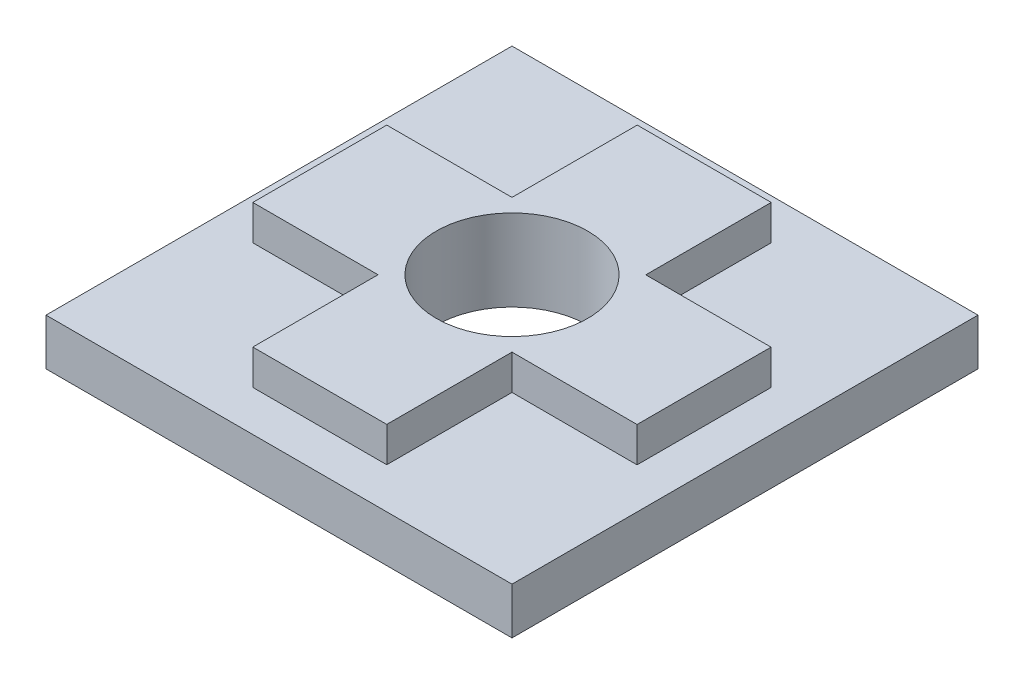
ISO-10303-21;
HEADER;
FILE_DESCRIPTION(('STEP AP214'),'2;1');
FILE_NAME('part.step','',(''),(''),'','','');
FILE_SCHEMA(('AUTOMOTIVE_DESIGN { 1 0 10303 214 1 1 1 1 }'));
ENDSEC;
DATA;
#1=APPLICATION_CONTEXT('core data for automotive mechanical design processes');
#2=APPLICATION_PROTOCOL_DEFINITION('international standard','automotive_design',2000,#1);
#3=PRODUCT_CONTEXT('',#1,'mechanical');
#4=PRODUCT('Part','Part','',(#3));
#5=PRODUCT_RELATED_PRODUCT_CATEGORY('part','',(#4));
#6=PRODUCT_DEFINITION_FORMATION('','',#4);
#7=PRODUCT_DEFINITION_CONTEXT('part definition',#1,'design');
#8=PRODUCT_DEFINITION('design','',#6,#7);
#9=PRODUCT_DEFINITION_SHAPE('','',#8);
#10=(LENGTH_UNIT() NAMED_UNIT(*) SI_UNIT(.MILLI.,.METRE.));
#11=(NAMED_UNIT(*) PLANE_ANGLE_UNIT() SI_UNIT($,.RADIAN.));
#12=(NAMED_UNIT(*) SI_UNIT($,.STERADIAN.) SOLID_ANGLE_UNIT());
#13=UNCERTAINTY_MEASURE_WITH_UNIT(LENGTH_MEASURE(1.E-05),#10,'distance_accuracy_value','');
#14=(GEOMETRIC_REPRESENTATION_CONTEXT(3) GLOBAL_UNCERTAINTY_ASSIGNED_CONTEXT((#13)) GLOBAL_UNIT_ASSIGNED_CONTEXT((#10,
#11,#12)) REPRESENTATION_CONTEXT('',''));
#15=CARTESIAN_POINT('',(0.,0.,0.));
#16=DIRECTION('',(0.,0.,1.));
#17=DIRECTION('',(1.,0.,0.));
#18=AXIS2_PLACEMENT_3D('',#15,#16,#17);
#19=CARTESIAN_POINT('',(0.,3.5,0.));
#20=DIRECTION('',(0.,-1.,0.));
#21=DIRECTION('',(0.,0.,-1.));
#22=AXIS2_PLACEMENT_3D('',#19,#20,#21);
#23=PLANE('',#22);
#24=DIRECTION('',(0.,0.,1.));
#25=VECTOR('',#24,1.);
#26=CARTESIAN_POINT('',(-2.875,3.5,-8.25));
#27=LINE('',#26,#25);
#28=CARTESIAN_POINT('',(-2.875,3.5,-8.25));
#29=VERTEX_POINT('',#28);
#30=CARTESIAN_POINT('',(-2.875,3.5,-2.875));
#31=VERTEX_POINT('',#30);
#32=EDGE_CURVE('E163',#29,#31,#27,.T.);
#33=ORIENTED_EDGE('',*,*,#32,.T.);
#34=DIRECTION('',(-1.,0.,0.));
#35=VECTOR('',#34,1.);
#36=CARTESIAN_POINT('',(-2.875,3.5,-2.875));
#37=LINE('',#36,#35);
#38=CARTESIAN_POINT('',(-8.25,3.5,-2.875));
#39=VERTEX_POINT('',#38);
#40=EDGE_CURVE('E151',#31,#39,#37,.T.);
#41=ORIENTED_EDGE('',*,*,#40,.T.);
#42=DIRECTION('',(0.,0.,1.));
#43=VECTOR('',#42,1.);
#44=CARTESIAN_POINT('',(-8.25,3.5,2.875));
#45=LINE('',#44,#43);
#46=CARTESIAN_POINT('',(-8.25,3.5,2.875));
#47=VERTEX_POINT('',#46);
#48=EDGE_CURVE('E162',#39,#47,#45,.T.);
#49=ORIENTED_EDGE('',*,*,#48,.T.);
#50=DIRECTION('',(1.,0.,0.));
#51=VECTOR('',#50,1.);
#52=CARTESIAN_POINT('',(-8.25,3.5,2.875));
#53=LINE('',#52,#51);
#54=CARTESIAN_POINT('',(-2.875,3.5,2.875));
#55=VERTEX_POINT('',#54);
#56=EDGE_CURVE('E433',#47,#55,#53,.T.);
#57=ORIENTED_EDGE('',*,*,#56,.T.);
#58=DIRECTION('',(0.,0.,1.));
#59=VECTOR('',#58,1.);
#60=CARTESIAN_POINT('',(-2.875,3.5,2.875));
#61=LINE('',#60,#59);
#62=CARTESIAN_POINT('',(-2.875,3.5,8.25));
#63=VERTEX_POINT('',#62);
#64=EDGE_CURVE('E436',#55,#63,#61,.T.);
#65=ORIENTED_EDGE('',*,*,#64,.T.);
#66=DIRECTION('',(1.,0.,0.));
#67=VECTOR('',#66,1.);
#68=CARTESIAN_POINT('',(-2.875,3.5,8.25));
#69=LINE('',#68,#67);
#70=CARTESIAN_POINT('',(2.875,3.5,8.25));
#71=VERTEX_POINT('',#70);
#72=EDGE_CURVE('E439',#63,#71,#69,.T.);
#73=ORIENTED_EDGE('',*,*,#72,.T.);
#74=DIRECTION('',(0.,0.,-1.));
#75=VECTOR('',#74,1.);
#76=CARTESIAN_POINT('',(2.875,3.5,8.25));
#77=LINE('',#76,#75);
#78=CARTESIAN_POINT('',(2.875,3.5,2.875));
#79=VERTEX_POINT('',#78);
#80=EDGE_CURVE('E442',#71,#79,#77,.T.);
#81=ORIENTED_EDGE('',*,*,#80,.T.);
#82=DIRECTION('',(0.999999019991865,0.,0.00140000546784625));
#83=VECTOR('',#82,1.);
#84=CARTESIAN_POINT('',(2.875,3.5,2.875));
#85=LINE('',#84,#83);
#86=CARTESIAN_POINT('',(8.25,3.5,2.88252503676427));
#87=VERTEX_POINT('',#86);
#88=EDGE_CURVE('E445',#79,#87,#85,.T.);
#89=ORIENTED_EDGE('',*,*,#88,.T.);
#90=DIRECTION('',(0.,0.,-1.));
#91=VECTOR('',#90,1.);
#92=CARTESIAN_POINT('',(8.25,3.5,2.88252503676427));
#93=LINE('',#92,#91);
#94=CARTESIAN_POINT('',(8.25,3.5,-2.86747496323573));
#95=VERTEX_POINT('',#94);
#96=EDGE_CURVE('E448',#87,#95,#93,.T.);
#97=ORIENTED_EDGE('',*,*,#96,.T.);
#98=DIRECTION('',(-1.,0.,0.));
#99=VECTOR('',#98,1.);
#100=CARTESIAN_POINT('',(8.25,3.5,-2.86747496323573));
#101=LINE('',#100,#99);
#102=CARTESIAN_POINT('',(2.875,3.5,-2.86747496323573));
#103=VERTEX_POINT('',#102);
#104=EDGE_CURVE('E451',#95,#103,#101,.T.);
#105=ORIENTED_EDGE('',*,*,#104,.T.);
#106=DIRECTION('',(0.,0.,-1.));
#107=VECTOR('',#106,1.);
#108=CARTESIAN_POINT('',(2.875,3.5,-2.86747496323573));
#109=LINE('',#108,#107);
#110=CARTESIAN_POINT('',(2.875,3.5,-8.25));
#111=VERTEX_POINT('',#110);
#112=EDGE_CURVE('E454',#103,#111,#109,.T.);
#113=ORIENTED_EDGE('',*,*,#112,.T.);
#114=DIRECTION('',(-1.,0.,0.));
#115=VECTOR('',#114,1.);
#116=CARTESIAN_POINT('',(-2.875,3.5,-8.25));
#117=LINE('',#116,#115);
#118=EDGE_CURVE('E168',#111,#29,#117,.T.);
#119=ORIENTED_EDGE('',*,*,#118,.T.);
#120=EDGE_LOOP('',(#33,#41,#49,#57,#65,#73,#81,#89,#97,#105,#113,#119));
#121=FACE_BOUND('',#120,.T.);
#122=CARTESIAN_POINT('',(0.,3.5,0.));
#123=DIRECTION('',(0.,1.,0.));
#124=DIRECTION('',(0.,0.,1.));
#125=AXIS2_PLACEMENT_3D('',#122,#123,#124);
#126=CIRCLE('',#125,3.25);
#127=CARTESIAN_POINT('',(0.,3.5,3.25));
#128=VERTEX_POINT('',#127);
#129=EDGE_CURVE('E425',#128,#128,#126,.T.);
#130=ORIENTED_EDGE('',*,*,#129,.F.);
#131=EDGE_LOOP('',(#130));
#132=FACE_BOUND('',#131,.T.);
#133=ADVANCED_FACE('F39',(#121,#132),#23,.F.);
#134=CARTESIAN_POINT('',(10.,2.,-10.));
#135=DIRECTION('',(-1.,0.,0.));
#136=DIRECTION('',(0.,0.,1.));
#137=AXIS2_PLACEMENT_3D('',#134,#135,#136);
#138=PLANE('',#137);
#139=DIRECTION('',(0.,0.,-1.));
#140=VECTOR('',#139,1.);
#141=CARTESIAN_POINT('',(10.,0.,-10.));
#142=LINE('',#141,#140);
#143=CARTESIAN_POINT('',(10.,0.,10.));
#144=VERTEX_POINT('',#143);
#145=CARTESIAN_POINT('',(10.,0.,-10.));
#146=VERTEX_POINT('',#145);
#147=EDGE_CURVE('E176',#144,#146,#142,.T.);
#148=ORIENTED_EDGE('',*,*,#147,.T.);
#149=DIRECTION('',(0.,-1.,0.));
#150=VECTOR('',#149,1.);
#151=CARTESIAN_POINT('',(10.,2.,-10.));
#152=LINE('',#151,#150);
#153=CARTESIAN_POINT('',(10.,2.,-10.));
#154=VERTEX_POINT('',#153);
#155=EDGE_CURVE('E11',#154,#146,#152,.T.);
#156=ORIENTED_EDGE('',*,*,#155,.F.);
#157=DIRECTION('',(0.,0.,-1.));
#158=VECTOR('',#157,1.);
#159=CARTESIAN_POINT('',(10.,2.,-10.));
#160=LINE('',#159,#158);
#161=CARTESIAN_POINT('',(10.,2.,10.));
#162=VERTEX_POINT('',#161);
#163=EDGE_CURVE('E187',#162,#154,#160,.T.);
#164=ORIENTED_EDGE('',*,*,#163,.F.);
#165=DIRECTION('',(0.,-1.,0.));
#166=VECTOR('',#165,1.);
#167=CARTESIAN_POINT('',(10.,2.,10.));
#168=LINE('',#167,#166);
#169=EDGE_CURVE('E200',#162,#144,#168,.T.);
#170=ORIENTED_EDGE('',*,*,#169,.T.);
#171=EDGE_LOOP('',(#148,#156,#164,#170));
#172=FACE_BOUND('',#171,.T.);
#173=ADVANCED_FACE('F41',(#172),#138,.F.);
#174=CARTESIAN_POINT('',(-10.,2.,-10.));
#175=DIRECTION('',(0.,0.,1.));
#176=DIRECTION('',(1.,0.,0.));
#177=AXIS2_PLACEMENT_3D('',#174,#175,#176);
#178=PLANE('',#177);
#179=DIRECTION('',(-1.,0.,0.));
#180=VECTOR('',#179,1.);
#181=CARTESIAN_POINT('',(-10.,0.,-10.));
#182=LINE('',#181,#180);
#183=CARTESIAN_POINT('',(-10.,0.,-10.));
#184=VERTEX_POINT('',#183);
#185=EDGE_CURVE('E181',#146,#184,#182,.T.);
#186=ORIENTED_EDGE('',*,*,#185,.T.);
#187=DIRECTION('',(0.,-1.,0.));
#188=VECTOR('',#187,1.);
#189=CARTESIAN_POINT('',(-10.,2.,-10.));
#190=LINE('',#189,#188);
#191=CARTESIAN_POINT('',(-10.,2.,-10.));
#192=VERTEX_POINT('',#191);
#193=EDGE_CURVE('E48',#192,#184,#190,.T.);
#194=ORIENTED_EDGE('',*,*,#193,.F.);
#195=DIRECTION('',(-1.,0.,0.));
#196=VECTOR('',#195,1.);
#197=CARTESIAN_POINT('',(-10.,2.,-10.));
#198=LINE('',#197,#196);
#199=EDGE_CURVE('E191',#154,#192,#198,.T.);
#200=ORIENTED_EDGE('',*,*,#199,.F.);
#201=ORIENTED_EDGE('',*,*,#155,.T.);
#202=EDGE_LOOP('',(#186,#194,#200,#201));
#203=FACE_BOUND('',#202,.T.);
#204=ADVANCED_FACE('F237',(#203),#178,.F.);
#205=CARTESIAN_POINT('',(-10.,2.,-10.));
#206=DIRECTION('',(1.,0.,0.));
#207=DIRECTION('',(0.,0.,-1.));
#208=AXIS2_PLACEMENT_3D('',#205,#206,#207);
#209=PLANE('',#208);
#210=DIRECTION('',(0.,0.,1.));
#211=VECTOR('',#210,1.);
#212=CARTESIAN_POINT('',(-10.,0.,-10.));
#213=LINE('',#212,#211);
#214=CARTESIAN_POINT('',(-10.,0.,10.));
#215=VERTEX_POINT('',#214);
#216=EDGE_CURVE('E204',#184,#215,#213,.T.);
#217=ORIENTED_EDGE('',*,*,#216,.T.);
#218=DIRECTION('',(0.,-1.,0.));
#219=VECTOR('',#218,1.);
#220=CARTESIAN_POINT('',(-10.,2.,10.));
#221=LINE('',#220,#219);
#222=CARTESIAN_POINT('',(-10.,2.,10.));
#223=VERTEX_POINT('',#222);
#224=EDGE_CURVE('E212',#223,#215,#221,.T.);
#225=ORIENTED_EDGE('',*,*,#224,.F.);
#226=DIRECTION('',(0.,0.,1.));
#227=VECTOR('',#226,1.);
#228=CARTESIAN_POINT('',(-10.,2.,-10.));
#229=LINE('',#228,#227);
#230=EDGE_CURVE('E195',#192,#223,#229,.T.);
#231=ORIENTED_EDGE('',*,*,#230,.F.);
#232=ORIENTED_EDGE('',*,*,#193,.T.);
#233=EDGE_LOOP('',(#217,#225,#231,#232));
#234=FACE_BOUND('',#233,.T.);
#235=ADVANCED_FACE('F221',(#234),#209,.F.);
#236=CARTESIAN_POINT('',(-10.,2.,10.));
#237=DIRECTION('',(0.,0.,-1.));
#238=DIRECTION('',(-1.,0.,0.));
#239=AXIS2_PLACEMENT_3D('',#236,#237,#238);
#240=PLANE('',#239);
#241=DIRECTION('',(1.,0.,0.));
#242=VECTOR('',#241,1.);
#243=CARTESIAN_POINT('',(-10.,0.,10.));
#244=LINE('',#243,#242);
#245=EDGE_CURVE('E192',#215,#144,#244,.T.);
#246=ORIENTED_EDGE('',*,*,#245,.T.);
#247=ORIENTED_EDGE('',*,*,#169,.F.);
#248=DIRECTION('',(1.,0.,0.));
#249=VECTOR('',#248,1.);
#250=CARTESIAN_POINT('',(-10.,2.,10.));
#251=LINE('',#250,#249);
#252=EDGE_CURVE('E198',#223,#162,#251,.T.);
#253=ORIENTED_EDGE('',*,*,#252,.F.);
#254=ORIENTED_EDGE('',*,*,#224,.T.);
#255=EDGE_LOOP('',(#246,#247,#253,#254));
#256=FACE_BOUND('',#255,.T.);
#257=ADVANCED_FACE('F230',(#256),#240,.F.);
#258=CARTESIAN_POINT('',(0.,2.,0.));
#259=DIRECTION('',(0.,1.,0.));
#260=DIRECTION('',(0.,0.,1.));
#261=AXIS2_PLACEMENT_3D('',#258,#259,#260);
#262=PLANE('',#261);
#263=DIRECTION('',(0.,0.,1.));
#264=VECTOR('',#263,1.);
#265=CARTESIAN_POINT('',(-2.875,2.,-8.25));
#266=LINE('',#265,#264);
#267=CARTESIAN_POINT('',(-2.875,2.,-8.25));
#268=VERTEX_POINT('',#267);
#269=CARTESIAN_POINT('',(-2.875,2.,-2.875));
#270=VERTEX_POINT('',#269);
#271=EDGE_CURVE('E55',#268,#270,#266,.T.);
#272=ORIENTED_EDGE('',*,*,#271,.F.);
#273=DIRECTION('',(-1.,0.,0.));
#274=VECTOR('',#273,1.);
#275=CARTESIAN_POINT('',(-2.875,2.,-8.25));
#276=LINE('',#275,#274);
#277=CARTESIAN_POINT('',(2.875,2.,-8.25));
#278=VERTEX_POINT('',#277);
#279=EDGE_CURVE('E59',#278,#268,#276,.T.);
#280=ORIENTED_EDGE('',*,*,#279,.F.);
#281=DIRECTION('',(0.,0.,-1.));
#282=VECTOR('',#281,1.);
#283=CARTESIAN_POINT('',(2.875,2.,-2.86747496323573));
#284=LINE('',#283,#282);
#285=CARTESIAN_POINT('',(2.875,2.,-2.86747496323573));
#286=VERTEX_POINT('',#285);
#287=EDGE_CURVE('E497',#286,#278,#284,.T.);
#288=ORIENTED_EDGE('',*,*,#287,.F.);
#289=DIRECTION('',(-1.,0.,0.));
#290=VECTOR('',#289,1.);
#291=CARTESIAN_POINT('',(8.25,2.,-2.86747496323573));
#292=LINE('',#291,#290);
#293=CARTESIAN_POINT('',(8.25,2.,-2.86747496323573));
#294=VERTEX_POINT('',#293);
#295=EDGE_CURVE('E493',#294,#286,#292,.T.);
#296=ORIENTED_EDGE('',*,*,#295,.F.);
#297=DIRECTION('',(0.,0.,-1.));
#298=VECTOR('',#297,1.);
#299=CARTESIAN_POINT('',(8.25,2.,2.88252503676427));
#300=LINE('',#299,#298);
#301=CARTESIAN_POINT('',(8.25,2.,2.88252503676427));
#302=VERTEX_POINT('',#301);
#303=EDGE_CURVE('E489',#302,#294,#300,.T.);
#304=ORIENTED_EDGE('',*,*,#303,.F.);
#305=DIRECTION('',(0.999999019991865,0.,0.00140000546784625));
#306=VECTOR('',#305,1.);
#307=CARTESIAN_POINT('',(2.875,2.,2.875));
#308=LINE('',#307,#306);
#309=CARTESIAN_POINT('',(2.875,2.,2.875));
#310=VERTEX_POINT('',#309);
#311=EDGE_CURVE('E485',#310,#302,#308,.T.);
#312=ORIENTED_EDGE('',*,*,#311,.F.);
#313=DIRECTION('',(0.,0.,-1.));
#314=VECTOR('',#313,1.);
#315=CARTESIAN_POINT('',(2.875,2.,8.25));
#316=LINE('',#315,#314);
#317=CARTESIAN_POINT('',(2.875,2.,8.25));
#318=VERTEX_POINT('',#317);
#319=EDGE_CURVE('E481',#318,#310,#316,.T.);
#320=ORIENTED_EDGE('',*,*,#319,.F.);
#321=DIRECTION('',(1.,0.,0.));
#322=VECTOR('',#321,1.);
#323=CARTESIAN_POINT('',(-2.875,2.,8.25));
#324=LINE('',#323,#322);
#325=CARTESIAN_POINT('',(-2.875,2.,8.25));
#326=VERTEX_POINT('',#325);
#327=EDGE_CURVE('E477',#326,#318,#324,.T.);
#328=ORIENTED_EDGE('',*,*,#327,.F.);
#329=DIRECTION('',(0.,0.,1.));
#330=VECTOR('',#329,1.);
#331=CARTESIAN_POINT('',(-2.875,2.,2.875));
#332=LINE('',#331,#330);
#333=CARTESIAN_POINT('',(-2.875,2.,2.875));
#334=VERTEX_POINT('',#333);
#335=EDGE_CURVE('E473',#334,#326,#332,.T.);
#336=ORIENTED_EDGE('',*,*,#335,.F.);
#337=DIRECTION('',(1.,0.,0.));
#338=VECTOR('',#337,1.);
#339=CARTESIAN_POINT('',(-8.25,2.,2.875));
#340=LINE('',#339,#338);
#341=CARTESIAN_POINT('',(-8.25,2.,2.875));
#342=VERTEX_POINT('',#341);
#343=EDGE_CURVE('E469',#342,#334,#340,.T.);
#344=ORIENTED_EDGE('',*,*,#343,.F.);
#345=DIRECTION('',(0.,0.,1.));
#346=VECTOR('',#345,1.);
#347=CARTESIAN_POINT('',(-8.25,2.,2.875));
#348=LINE('',#347,#346);
#349=CARTESIAN_POINT('',(-8.25,2.,-2.875));
#350=VERTEX_POINT('',#349);
#351=EDGE_CURVE('E465',#350,#342,#348,.T.);
#352=ORIENTED_EDGE('',*,*,#351,.F.);
#353=DIRECTION('',(-1.,0.,0.));
#354=VECTOR('',#353,1.);
#355=CARTESIAN_POINT('',(-2.875,2.,-2.875));
#356=LINE('',#355,#354);
#357=EDGE_CURVE('E462',#270,#350,#356,.T.);
#358=ORIENTED_EDGE('',*,*,#357,.F.);
#359=EDGE_LOOP('',(#272,#280,#288,#296,#304,#312,#320,#328,#336,#344,#352,#358));
#360=FACE_BOUND('',#359,.T.);
#361=ORIENTED_EDGE('',*,*,#163,.T.);
#362=ORIENTED_EDGE('',*,*,#199,.T.);
#363=ORIENTED_EDGE('',*,*,#230,.T.);
#364=ORIENTED_EDGE('',*,*,#252,.T.);
#365=EDGE_LOOP('',(#361,#362,#363,#364));
#366=FACE_BOUND('',#365,.T.);
#367=ADVANCED_FACE('F236',(#360,#366),#262,.T.);
#368=CARTESIAN_POINT('',(0.,0.,0.));
#369=DIRECTION('',(0.,1.,0.));
#370=DIRECTION('',(0.,0.,1.));
#371=AXIS2_PLACEMENT_3D('',#368,#369,#370);
#372=PLANE('',#371);
#373=CARTESIAN_POINT('',(0.,0.,0.));
#374=DIRECTION('',(0.,1.,0.));
#375=DIRECTION('',(0.,0.,1.));
#376=AXIS2_PLACEMENT_3D('',#373,#374,#375);
#377=CIRCLE('',#376,3.25);
#378=CARTESIAN_POINT('',(0.,0.,3.25));
#379=VERTEX_POINT('',#378);
#380=EDGE_CURVE('E422',#379,#379,#377,.T.);
#381=ORIENTED_EDGE('',*,*,#380,.T.);
#382=EDGE_LOOP('',(#381));
#383=FACE_BOUND('',#382,.T.);
#384=ORIENTED_EDGE('',*,*,#147,.F.);
#385=ORIENTED_EDGE('',*,*,#245,.F.);
#386=ORIENTED_EDGE('',*,*,#216,.F.);
#387=ORIENTED_EDGE('',*,*,#185,.F.);
#388=EDGE_LOOP('',(#384,#385,#386,#387));
#389=FACE_BOUND('',#388,.T.);
#390=ADVANCED_FACE('F227',(#383,#389),#372,.F.);
#391=CARTESIAN_POINT('',(-2.875,3.5,-8.25));
#392=DIRECTION('',(1.,0.,0.));
#393=DIRECTION('',(0.,0.,-1.));
#394=AXIS2_PLACEMENT_3D('',#391,#392,#393);
#395=PLANE('',#394);
#396=ORIENTED_EDGE('',*,*,#271,.T.);
#397=DIRECTION('',(0.,-1.,0.));
#398=VECTOR('',#397,1.);
#399=CARTESIAN_POINT('',(-2.875,3.5,-2.875));
#400=LINE('',#399,#398);
#401=EDGE_CURVE('E156',#31,#270,#400,.T.);
#402=ORIENTED_EDGE('',*,*,#401,.F.);
#403=ORIENTED_EDGE('',*,*,#32,.F.);
#404=DIRECTION('',(0.,-1.,0.));
#405=VECTOR('',#404,1.);
#406=CARTESIAN_POINT('',(-2.875,3.5,-8.25));
#407=LINE('',#406,#405);
#408=EDGE_CURVE('E459',#29,#268,#407,.T.);
#409=ORIENTED_EDGE('',*,*,#408,.T.);
#410=EDGE_LOOP('',(#396,#402,#403,#409));
#411=FACE_BOUND('',#410,.T.);
#412=ADVANCED_FACE('F174',(#411),#395,.F.);
#413=CARTESIAN_POINT('',(-2.875,3.5,-2.875));
#414=DIRECTION('',(0.,0.,1.));
#415=DIRECTION('',(1.,0.,0.));
#416=AXIS2_PLACEMENT_3D('',#413,#414,#415);
#417=PLANE('',#416);
#418=ORIENTED_EDGE('',*,*,#357,.T.);
#419=DIRECTION('',(0.,-1.,0.));
#420=VECTOR('',#419,1.);
#421=CARTESIAN_POINT('',(-8.25,3.5,-2.875));
#422=LINE('',#421,#420);
#423=EDGE_CURVE('E158',#39,#350,#422,.T.);
#424=ORIENTED_EDGE('',*,*,#423,.F.);
#425=ORIENTED_EDGE('',*,*,#40,.F.);
#426=ORIENTED_EDGE('',*,*,#401,.T.);
#427=EDGE_LOOP('',(#418,#424,#425,#426));
#428=FACE_BOUND('',#427,.T.);
#429=ADVANCED_FACE('F154',(#428),#417,.F.);
#430=CARTESIAN_POINT('',(-8.25,3.5,2.875));
#431=DIRECTION('',(1.,0.,0.));
#432=DIRECTION('',(0.,0.,-1.));
#433=AXIS2_PLACEMENT_3D('',#430,#431,#432);
#434=PLANE('',#433);
#435=ORIENTED_EDGE('',*,*,#351,.T.);
#436=DIRECTION('',(0.,-1.,0.));
#437=VECTOR('',#436,1.);
#438=CARTESIAN_POINT('',(-8.25,3.5,2.875));
#439=LINE('',#438,#437);
#440=EDGE_CURVE('E183',#47,#342,#439,.T.);
#441=ORIENTED_EDGE('',*,*,#440,.F.);
#442=ORIENTED_EDGE('',*,*,#48,.F.);
#443=ORIENTED_EDGE('',*,*,#423,.T.);
#444=EDGE_LOOP('',(#435,#441,#442,#443));
#445=FACE_BOUND('',#444,.T.);
#446=ADVANCED_FACE('F286',(#445),#434,.F.);
#447=CARTESIAN_POINT('',(-8.25,3.5,2.875));
#448=DIRECTION('',(0.,0.,-1.));
#449=DIRECTION('',(-1.,0.,0.));
#450=AXIS2_PLACEMENT_3D('',#447,#448,#449);
#451=PLANE('',#450);
#452=ORIENTED_EDGE('',*,*,#343,.T.);
#453=DIRECTION('',(0.,-1.,0.));
#454=VECTOR('',#453,1.);
#455=CARTESIAN_POINT('',(-2.875,3.5,2.875));
#456=LINE('',#455,#454);
#457=EDGE_CURVE('E532',#55,#334,#456,.T.);
#458=ORIENTED_EDGE('',*,*,#457,.F.);
#459=ORIENTED_EDGE('',*,*,#56,.F.);
#460=ORIENTED_EDGE('',*,*,#440,.T.);
#461=EDGE_LOOP('',(#452,#458,#459,#460));
#462=FACE_BOUND('',#461,.T.);
#463=ADVANCED_FACE('F282',(#462),#451,.F.);
#464=CARTESIAN_POINT('',(-2.875,3.5,2.875));
#465=DIRECTION('',(1.,0.,0.));
#466=DIRECTION('',(0.,0.,-1.));
#467=AXIS2_PLACEMENT_3D('',#464,#465,#466);
#468=PLANE('',#467);
#469=ORIENTED_EDGE('',*,*,#335,.T.);
#470=DIRECTION('',(0.,-1.,0.));
#471=VECTOR('',#470,1.);
#472=CARTESIAN_POINT('',(-2.875,3.5,8.25));
#473=LINE('',#472,#471);
#474=EDGE_CURVE('E528',#63,#326,#473,.T.);
#475=ORIENTED_EDGE('',*,*,#474,.F.);
#476=ORIENTED_EDGE('',*,*,#64,.F.);
#477=ORIENTED_EDGE('',*,*,#457,.T.);
#478=EDGE_LOOP('',(#469,#475,#476,#477));
#479=FACE_BOUND('',#478,.T.);
#480=ADVANCED_FACE('F278',(#479),#468,.F.);
#481=CARTESIAN_POINT('',(-2.875,3.5,8.25));
#482=DIRECTION('',(0.,0.,-1.));
#483=DIRECTION('',(-1.,0.,0.));
#484=AXIS2_PLACEMENT_3D('',#481,#482,#483);
#485=PLANE('',#484);
#486=ORIENTED_EDGE('',*,*,#327,.T.);
#487=DIRECTION('',(0.,-1.,0.));
#488=VECTOR('',#487,1.);
#489=CARTESIAN_POINT('',(2.875,3.5,8.25));
#490=LINE('',#489,#488);
#491=EDGE_CURVE('E524',#71,#318,#490,.T.);
#492=ORIENTED_EDGE('',*,*,#491,.F.);
#493=ORIENTED_EDGE('',*,*,#72,.F.);
#494=ORIENTED_EDGE('',*,*,#474,.T.);
#495=EDGE_LOOP('',(#486,#492,#493,#494));
#496=FACE_BOUND('',#495,.T.);
#497=ADVANCED_FACE('F274',(#496),#485,.F.);
#498=CARTESIAN_POINT('',(2.875,3.5,8.25));
#499=DIRECTION('',(-1.,0.,0.));
#500=DIRECTION('',(0.,0.,1.));
#501=AXIS2_PLACEMENT_3D('',#498,#499,#500);
#502=PLANE('',#501);
#503=ORIENTED_EDGE('',*,*,#319,.T.);
#504=DIRECTION('',(0.,-1.,0.));
#505=VECTOR('',#504,1.);
#506=CARTESIAN_POINT('',(2.875,3.5,2.875));
#507=LINE('',#506,#505);
#508=EDGE_CURVE('E520',#79,#310,#507,.T.);
#509=ORIENTED_EDGE('',*,*,#508,.F.);
#510=ORIENTED_EDGE('',*,*,#80,.F.);
#511=ORIENTED_EDGE('',*,*,#491,.T.);
#512=EDGE_LOOP('',(#503,#509,#510,#511));
#513=FACE_BOUND('',#512,.T.);
#514=ADVANCED_FACE('F270',(#513),#502,.F.);
#515=CARTESIAN_POINT('',(2.875,3.5,2.875));
#516=DIRECTION('',(0.00140000546784625,0.,-0.999999019991865));
#517=DIRECTION('',(-0.999999019991865,0.,-0.00140000546784625));
#518=AXIS2_PLACEMENT_3D('',#515,#516,#517);
#519=PLANE('',#518);
#520=ORIENTED_EDGE('',*,*,#311,.T.);
#521=DIRECTION('',(0.,-1.,0.));
#522=VECTOR('',#521,1.);
#523=CARTESIAN_POINT('',(8.25,3.5,2.88252503676427));
#524=LINE('',#523,#522);
#525=EDGE_CURVE('E516',#87,#302,#524,.T.);
#526=ORIENTED_EDGE('',*,*,#525,.F.);
#527=ORIENTED_EDGE('',*,*,#88,.F.);
#528=ORIENTED_EDGE('',*,*,#508,.T.);
#529=EDGE_LOOP('',(#520,#526,#527,#528));
#530=FACE_BOUND('',#529,.T.);
#531=ADVANCED_FACE('F266',(#530),#519,.F.);
#532=CARTESIAN_POINT('',(8.25,3.5,2.88252503676427));
#533=DIRECTION('',(-1.,0.,0.));
#534=DIRECTION('',(0.,0.,1.));
#535=AXIS2_PLACEMENT_3D('',#532,#533,#534);
#536=PLANE('',#535);
#537=ORIENTED_EDGE('',*,*,#303,.T.);
#538=DIRECTION('',(0.,-1.,0.));
#539=VECTOR('',#538,1.);
#540=CARTESIAN_POINT('',(8.25,3.5,-2.86747496323573));
#541=LINE('',#540,#539);
#542=EDGE_CURVE('E512',#95,#294,#541,.T.);
#543=ORIENTED_EDGE('',*,*,#542,.F.);
#544=ORIENTED_EDGE('',*,*,#96,.F.);
#545=ORIENTED_EDGE('',*,*,#525,.T.);
#546=EDGE_LOOP('',(#537,#543,#544,#545));
#547=FACE_BOUND('',#546,.T.);
#548=ADVANCED_FACE('F262',(#547),#536,.F.);
#549=CARTESIAN_POINT('',(8.25,3.5,-2.86747496323573));
#550=DIRECTION('',(0.,0.,1.));
#551=DIRECTION('',(1.,0.,0.));
#552=AXIS2_PLACEMENT_3D('',#549,#550,#551);
#553=PLANE('',#552);
#554=ORIENTED_EDGE('',*,*,#295,.T.);
#555=DIRECTION('',(0.,-1.,0.));
#556=VECTOR('',#555,1.);
#557=CARTESIAN_POINT('',(2.875,3.5,-2.86747496323573));
#558=LINE('',#557,#556);
#559=EDGE_CURVE('E508',#103,#286,#558,.T.);
#560=ORIENTED_EDGE('',*,*,#559,.F.);
#561=ORIENTED_EDGE('',*,*,#104,.F.);
#562=ORIENTED_EDGE('',*,*,#542,.T.);
#563=EDGE_LOOP('',(#554,#560,#561,#562));
#564=FACE_BOUND('',#563,.T.);
#565=ADVANCED_FACE('F258',(#564),#553,.F.);
#566=CARTESIAN_POINT('',(2.875,3.5,-2.86747496323573));
#567=DIRECTION('',(-1.,0.,0.));
#568=DIRECTION('',(0.,0.,1.));
#569=AXIS2_PLACEMENT_3D('',#566,#567,#568);
#570=PLANE('',#569);
#571=ORIENTED_EDGE('',*,*,#287,.T.);
#572=DIRECTION('',(0.,-1.,0.));
#573=VECTOR('',#572,1.);
#574=CARTESIAN_POINT('',(2.875,3.5,-8.25));
#575=LINE('',#574,#573);
#576=EDGE_CURVE('E504',#111,#278,#575,.T.);
#577=ORIENTED_EDGE('',*,*,#576,.F.);
#578=ORIENTED_EDGE('',*,*,#112,.F.);
#579=ORIENTED_EDGE('',*,*,#559,.T.);
#580=EDGE_LOOP('',(#571,#577,#578,#579));
#581=FACE_BOUND('',#580,.T.);
#582=ADVANCED_FACE('F254',(#581),#570,.F.);
#583=CARTESIAN_POINT('',(-2.875,3.5,-8.25));
#584=DIRECTION('',(0.,0.,1.));
#585=DIRECTION('',(1.,0.,0.));
#586=AXIS2_PLACEMENT_3D('',#583,#584,#585);
#587=PLANE('',#586);
#588=ORIENTED_EDGE('',*,*,#279,.T.);
#589=ORIENTED_EDGE('',*,*,#408,.F.);
#590=ORIENTED_EDGE('',*,*,#118,.F.);
#591=ORIENTED_EDGE('',*,*,#576,.T.);
#592=EDGE_LOOP('',(#588,#589,#590,#591));
#593=FACE_BOUND('',#592,.T.);
#594=ADVANCED_FACE('F251',(#593),#587,.F.);
#595=CARTESIAN_POINT('',(0.,3.5,0.));
#596=DIRECTION('',(0.,1.,0.));
#597=DIRECTION('',(0.,0.,1.));
#598=AXIS2_PLACEMENT_3D('',#595,#596,#597);
#599=CYLINDRICAL_SURFACE('',#598,3.25);
#600=ORIENTED_EDGE('',*,*,#380,.F.);
#601=EDGE_LOOP('',(#600));
#602=FACE_BOUND('',#601,.T.);
#603=ORIENTED_EDGE('',*,*,#129,.T.);
#604=EDGE_LOOP('',(#603));
#605=FACE_BOUND('',#604,.T.);
#606=ADVANCED_FACE('F250',(#602,#605),#599,.F.);
#607=CLOSED_SHELL('',(#133,#173,#204,#235,#257,#367,#390,#412,#429,#446,#463,#480,#497,#514,
#531,#548,#565,#582,#594,#606));
#608=MANIFOLD_SOLID_BREP('B2',#607);
#609=ADVANCED_BREP_SHAPE_REPRESENTATION('',(#18,#608),#14);
#610=SHAPE_DEFINITION_REPRESENTATION(#9,#609);
ENDSEC;
END-ISO-10303-21;
